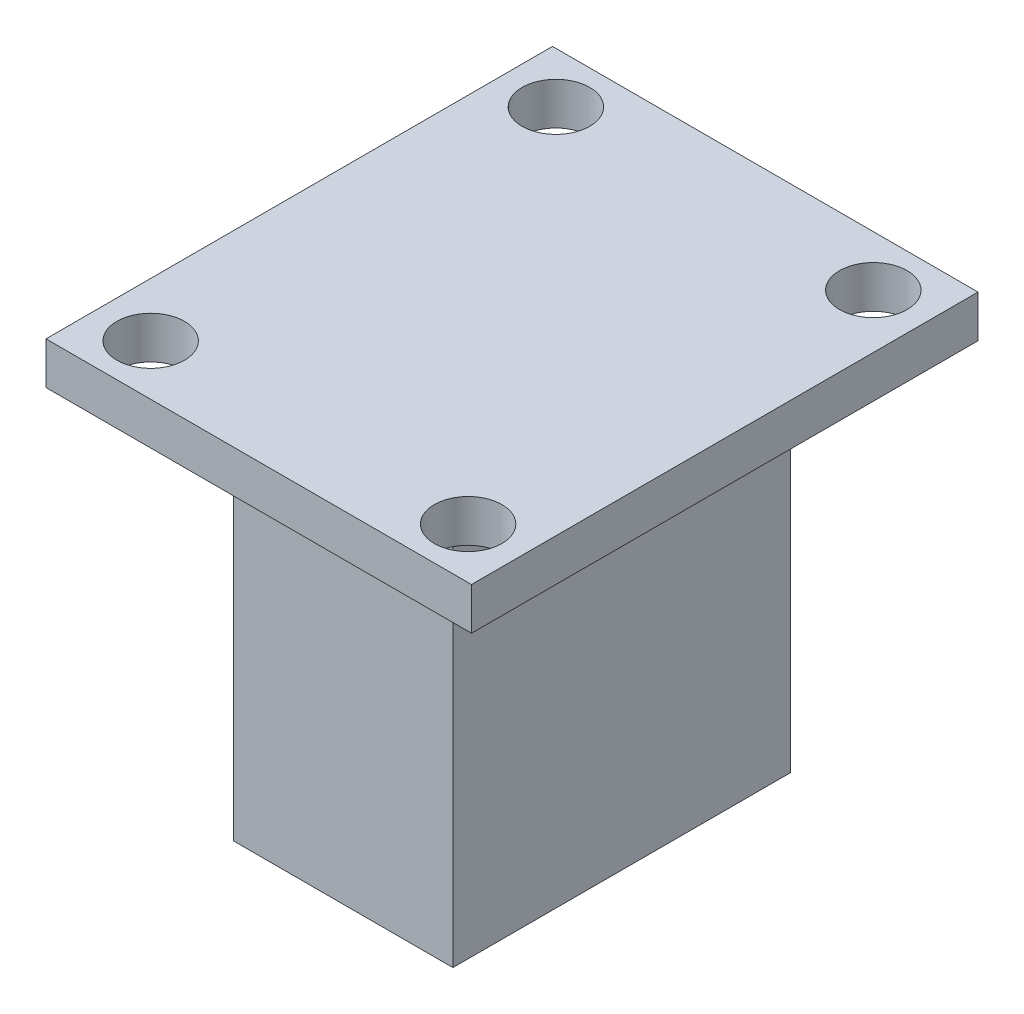
ISO-10303-21;
HEADER;
FILE_DESCRIPTION(('STEP AP214'),'2;1');
FILE_NAME('part.step','',(''),(''),'','','');
FILE_SCHEMA(('AUTOMOTIVE_DESIGN { 1 0 10303 214 1 1 1 1 }'));
ENDSEC;
DATA;
#1=APPLICATION_CONTEXT('core data for automotive mechanical design processes');
#2=APPLICATION_PROTOCOL_DEFINITION('international standard','automotive_design',2000,#1);
#3=PRODUCT_CONTEXT('',#1,'mechanical');
#4=PRODUCT('Part','Part','',(#3));
#5=PRODUCT_RELATED_PRODUCT_CATEGORY('part','',(#4));
#6=PRODUCT_DEFINITION_FORMATION('','',#4);
#7=PRODUCT_DEFINITION_CONTEXT('part definition',#1,'design');
#8=PRODUCT_DEFINITION('design','',#6,#7);
#9=PRODUCT_DEFINITION_SHAPE('','',#8);
#10=(LENGTH_UNIT() NAMED_UNIT(*) SI_UNIT(.MILLI.,.METRE.));
#11=(NAMED_UNIT(*) PLANE_ANGLE_UNIT() SI_UNIT($,.RADIAN.));
#12=(NAMED_UNIT(*) SI_UNIT($,.STERADIAN.) SOLID_ANGLE_UNIT());
#13=UNCERTAINTY_MEASURE_WITH_UNIT(LENGTH_MEASURE(1.E-05),#10,'distance_accuracy_value','');
#14=(GEOMETRIC_REPRESENTATION_CONTEXT(3) GLOBAL_UNCERTAINTY_ASSIGNED_CONTEXT((#13)) GLOBAL_UNIT_ASSIGNED_CONTEXT((#10,
#11,#12)) REPRESENTATION_CONTEXT('',''));
#15=CARTESIAN_POINT('',(0.,0.,0.));
#16=DIRECTION('',(0.,0.,1.));
#17=DIRECTION('',(1.,0.,0.));
#18=AXIS2_PLACEMENT_3D('',#15,#16,#17);
#19=CARTESIAN_POINT('',(-16.002,-3.175,19.05));
#20=DIRECTION('',(-1.,0.,0.));
#21=DIRECTION('',(0.,0.,1.));
#22=AXIS2_PLACEMENT_3D('',#19,#20,#21);
#23=PLANE('',#22);
#24=DIRECTION('',(0.,0.,1.));
#25=VECTOR('',#24,1.);
#26=CARTESIAN_POINT('',(-16.002,0.,19.05));
#27=LINE('',#26,#25);
#28=CARTESIAN_POINT('',(-16.002,0.,-19.05));
#29=VERTEX_POINT('',#28);
#30=CARTESIAN_POINT('',(-16.002,0.,19.05));
#31=VERTEX_POINT('',#30);
#32=EDGE_CURVE('E174',#29,#31,#27,.T.);
#33=ORIENTED_EDGE('',*,*,#32,.F.);
#34=DIRECTION('',(0.,1.,0.));
#35=VECTOR('',#34,1.);
#36=CARTESIAN_POINT('',(-16.002,-3.175,-19.05));
#37=LINE('',#36,#35);
#38=CARTESIAN_POINT('',(-16.002,-3.175,-19.05));
#39=VERTEX_POINT('',#38);
#40=EDGE_CURVE('E11',#39,#29,#37,.T.);
#41=ORIENTED_EDGE('',*,*,#40,.F.);
#42=DIRECTION('',(0.,0.,1.));
#43=VECTOR('',#42,1.);
#44=CARTESIAN_POINT('',(-16.002,-3.175,19.05));
#45=LINE('',#44,#43);
#46=CARTESIAN_POINT('',(-16.002,-3.175,19.05));
#47=VERTEX_POINT('',#46);
#48=EDGE_CURVE('E177',#39,#47,#45,.T.);
#49=ORIENTED_EDGE('',*,*,#48,.T.);
#50=DIRECTION('',(0.,1.,0.));
#51=VECTOR('',#50,1.);
#52=CARTESIAN_POINT('',(-16.002,-3.175,19.05));
#53=LINE('',#52,#51);
#54=EDGE_CURVE('E43',#47,#31,#53,.T.);
#55=ORIENTED_EDGE('',*,*,#54,.T.);
#56=EDGE_LOOP('',(#33,#41,#49,#55));
#57=FACE_BOUND('',#56,.T.);
#58=ADVANCED_FACE('F40',(#57),#23,.T.);
#59=CARTESIAN_POINT('',(16.002,-3.175,-19.05));
#60=DIRECTION('',(0.,0.,-1.));
#61=DIRECTION('',(-1.,0.,0.));
#62=AXIS2_PLACEMENT_3D('',#59,#60,#61);
#63=PLANE('',#62);
#64=DIRECTION('',(-1.,0.,0.));
#65=VECTOR('',#64,1.);
#66=CARTESIAN_POINT('',(16.002,0.,-19.05));
#67=LINE('',#66,#65);
#68=CARTESIAN_POINT('',(16.002,0.,-19.05));
#69=VERTEX_POINT('',#68);
#70=EDGE_CURVE('E180',#69,#29,#67,.T.);
#71=ORIENTED_EDGE('',*,*,#70,.F.);
#72=DIRECTION('',(0.,1.,0.));
#73=VECTOR('',#72,1.);
#74=CARTESIAN_POINT('',(16.002,-3.175,-19.05));
#75=LINE('',#74,#73);
#76=CARTESIAN_POINT('',(16.002,-3.175,-19.05));
#77=VERTEX_POINT('',#76);
#78=EDGE_CURVE('E48',#77,#69,#75,.T.);
#79=ORIENTED_EDGE('',*,*,#78,.F.);
#80=DIRECTION('',(-1.,0.,0.));
#81=VECTOR('',#80,1.);
#82=CARTESIAN_POINT('',(16.002,-3.175,-19.05));
#83=LINE('',#82,#81);
#84=EDGE_CURVE('E185',#77,#39,#83,.T.);
#85=ORIENTED_EDGE('',*,*,#84,.T.);
#86=ORIENTED_EDGE('',*,*,#40,.T.);
#87=EDGE_LOOP('',(#71,#79,#85,#86));
#88=FACE_BOUND('',#87,.T.);
#89=ADVANCED_FACE('F202',(#88),#63,.T.);
#90=CARTESIAN_POINT('',(16.002,-3.175,19.05));
#91=DIRECTION('',(1.,0.,0.));
#92=DIRECTION('',(0.,0.,-1.));
#93=AXIS2_PLACEMENT_3D('',#90,#91,#92);
#94=PLANE('',#93);
#95=DIRECTION('',(0.,0.,-1.));
#96=VECTOR('',#95,1.);
#97=CARTESIAN_POINT('',(16.002,0.,19.05));
#98=LINE('',#97,#96);
#99=CARTESIAN_POINT('',(16.002,0.,19.05));
#100=VERTEX_POINT('',#99);
#101=EDGE_CURVE('E192',#100,#69,#98,.T.);
#102=ORIENTED_EDGE('',*,*,#101,.F.);
#103=DIRECTION('',(0.,1.,0.));
#104=VECTOR('',#103,1.);
#105=CARTESIAN_POINT('',(16.002,-3.175,19.05));
#106=LINE('',#105,#104);
#107=CARTESIAN_POINT('',(16.002,-3.175,19.05));
#108=VERTEX_POINT('',#107);
#109=EDGE_CURVE('E197',#108,#100,#106,.T.);
#110=ORIENTED_EDGE('',*,*,#109,.F.);
#111=DIRECTION('',(0.,0.,-1.));
#112=VECTOR('',#111,1.);
#113=CARTESIAN_POINT('',(16.002,-3.175,19.05));
#114=LINE('',#113,#112);
#115=EDGE_CURVE('E182',#108,#77,#114,.T.);
#116=ORIENTED_EDGE('',*,*,#115,.T.);
#117=ORIENTED_EDGE('',*,*,#78,.T.);
#118=EDGE_LOOP('',(#102,#110,#116,#117));
#119=FACE_BOUND('',#118,.T.);
#120=ADVANCED_FACE('F206',(#119),#94,.T.);
#121=CARTESIAN_POINT('',(16.002,-3.175,19.05));
#122=DIRECTION('',(0.,0.,1.));
#123=DIRECTION('',(1.,0.,0.));
#124=AXIS2_PLACEMENT_3D('',#121,#122,#123);
#125=PLANE('',#124);
#126=DIRECTION('',(1.,0.,0.));
#127=VECTOR('',#126,1.);
#128=CARTESIAN_POINT('',(16.002,0.,19.05));
#129=LINE('',#128,#127);
#130=EDGE_CURVE('E189',#31,#100,#129,.T.);
#131=ORIENTED_EDGE('',*,*,#130,.F.);
#132=ORIENTED_EDGE('',*,*,#54,.F.);
#133=DIRECTION('',(1.,0.,0.));
#134=VECTOR('',#133,1.);
#135=CARTESIAN_POINT('',(16.002,-3.175,19.05));
#136=LINE('',#135,#134);
#137=EDGE_CURVE('E179',#47,#108,#136,.T.);
#138=ORIENTED_EDGE('',*,*,#137,.T.);
#139=ORIENTED_EDGE('',*,*,#109,.T.);
#140=EDGE_LOOP('',(#131,#132,#138,#139));
#141=FACE_BOUND('',#140,.T.);
#142=ADVANCED_FACE('F199',(#141),#125,.T.);
#143=CARTESIAN_POINT('',(0.,-3.175,0.));
#144=DIRECTION('',(0.,1.,0.));
#145=DIRECTION('',(0.,0.,1.));
#146=AXIS2_PLACEMENT_3D('',#143,#144,#145);
#147=PLANE('',#146);
#148=DIRECTION('',(-1.,0.,0.));
#149=VECTOR('',#148,1.);
#150=CARTESIAN_POINT('',(0.,-3.175,-12.7));
#151=LINE('',#150,#149);
#152=CARTESIAN_POINT('',(8.255,-3.175,-12.7));
#153=VERTEX_POINT('',#152);
#154=CARTESIAN_POINT('',(-8.255,-3.175,-12.7));
#155=VERTEX_POINT('',#154);
#156=EDGE_CURVE('E147',#153,#155,#151,.T.);
#157=ORIENTED_EDGE('',*,*,#156,.T.);
#158=DIRECTION('',(0.,0.,1.));
#159=VECTOR('',#158,1.);
#160=CARTESIAN_POINT('',(-8.255,-3.175,0.));
#161=LINE('',#160,#159);
#162=CARTESIAN_POINT('',(-8.255,-3.175,12.7));
#163=VERTEX_POINT('',#162);
#164=EDGE_CURVE('E150',#155,#163,#161,.T.);
#165=ORIENTED_EDGE('',*,*,#164,.T.);
#166=DIRECTION('',(1.,0.,0.));
#167=VECTOR('',#166,1.);
#168=CARTESIAN_POINT('',(0.,-3.175,12.7));
#169=LINE('',#168,#167);
#170=CARTESIAN_POINT('',(8.255,-3.175,12.7));
#171=VERTEX_POINT('',#170);
#172=EDGE_CURVE('E115',#163,#171,#169,.T.);
#173=ORIENTED_EDGE('',*,*,#172,.T.);
#174=DIRECTION('',(0.,0.,-1.));
#175=VECTOR('',#174,1.);
#176=CARTESIAN_POINT('',(8.255,-3.175,0.));
#177=LINE('',#176,#175);
#178=EDGE_CURVE('E144',#171,#153,#177,.T.);
#179=ORIENTED_EDGE('',*,*,#178,.T.);
#180=EDGE_LOOP('',(#157,#165,#173,#179));
#181=FACE_BOUND('',#180,.T.);
#182=CARTESIAN_POINT('',(11.938,-3.175,15.24));
#183=DIRECTION('',(0.,1.,0.));
#184=DIRECTION('',(0.,0.,1.));
#185=AXIS2_PLACEMENT_3D('',#182,#183,#184);
#186=CIRCLE('',#185,2.54);
#187=CARTESIAN_POINT('',(11.938,-3.175,17.78));
#188=VERTEX_POINT('',#187);
#189=EDGE_CURVE('E166',#188,#188,#186,.T.);
#190=ORIENTED_EDGE('',*,*,#189,.T.);
#191=EDGE_LOOP('',(#190));
#192=FACE_BOUND('',#191,.T.);
#193=CARTESIAN_POINT('',(-11.938,-3.175,15.24));
#194=DIRECTION('',(0.,1.,0.));
#195=DIRECTION('',(0.,0.,1.));
#196=AXIS2_PLACEMENT_3D('',#193,#194,#195);
#197=CIRCLE('',#196,2.54);
#198=CARTESIAN_POINT('',(-11.938,-3.175,17.78));
#199=VERTEX_POINT('',#198);
#200=EDGE_CURVE('E160',#199,#199,#197,.T.);
#201=ORIENTED_EDGE('',*,*,#200,.T.);
#202=EDGE_LOOP('',(#201));
#203=FACE_BOUND('',#202,.T.);
#204=CARTESIAN_POINT('',(-11.938,-3.175,-15.24));
#205=DIRECTION('',(0.,1.,0.));
#206=DIRECTION('',(0.,0.,1.));
#207=AXIS2_PLACEMENT_3D('',#204,#205,#206);
#208=CIRCLE('',#207,2.54);
#209=CARTESIAN_POINT('',(-11.938,-3.175,-12.7));
#210=VERTEX_POINT('',#209);
#211=EDGE_CURVE('E153',#210,#210,#208,.T.);
#212=ORIENTED_EDGE('',*,*,#211,.T.);
#213=EDGE_LOOP('',(#212));
#214=FACE_BOUND('',#213,.T.);
#215=CARTESIAN_POINT('',(11.938,-3.175,-15.24));
#216=DIRECTION('',(0.,1.,0.));
#217=DIRECTION('',(0.,0.,1.));
#218=AXIS2_PLACEMENT_3D('',#215,#216,#217);
#219=CIRCLE('',#218,2.54);
#220=CARTESIAN_POINT('',(11.938,-3.175,-12.7));
#221=VERTEX_POINT('',#220);
#222=EDGE_CURVE('E171',#221,#221,#219,.T.);
#223=ORIENTED_EDGE('',*,*,#222,.T.);
#224=EDGE_LOOP('',(#223));
#225=FACE_BOUND('',#224,.T.);
#226=ORIENTED_EDGE('',*,*,#48,.F.);
#227=ORIENTED_EDGE('',*,*,#84,.F.);
#228=ORIENTED_EDGE('',*,*,#115,.F.);
#229=ORIENTED_EDGE('',*,*,#137,.F.);
#230=EDGE_LOOP('',(#226,#227,#228,#229));
#231=FACE_BOUND('',#230,.T.);
#232=ADVANCED_FACE('F208',(#181,#192,#203,#214,#225,#231),#147,.F.);
#233=CARTESIAN_POINT('',(0.,0.,0.));
#234=DIRECTION('',(0.,1.,0.));
#235=DIRECTION('',(0.,0.,1.));
#236=AXIS2_PLACEMENT_3D('',#233,#234,#235);
#237=PLANE('',#236);
#238=CARTESIAN_POINT('',(11.938,0.,15.24));
#239=DIRECTION('',(0.,1.,0.));
#240=DIRECTION('',(0.,0.,1.));
#241=AXIS2_PLACEMENT_3D('',#238,#239,#240);
#242=CIRCLE('',#241,2.54);
#243=CARTESIAN_POINT('',(11.938,0.,17.78));
#244=VERTEX_POINT('',#243);
#245=EDGE_CURVE('E152',#244,#244,#242,.T.);
#246=ORIENTED_EDGE('',*,*,#245,.F.);
#247=EDGE_LOOP('',(#246));
#248=FACE_BOUND('',#247,.T.);
#249=CARTESIAN_POINT('',(-11.938,0.,15.24));
#250=DIRECTION('',(0.,1.,0.));
#251=DIRECTION('',(0.,0.,1.));
#252=AXIS2_PLACEMENT_3D('',#249,#250,#251);
#253=CIRCLE('',#252,2.54);
#254=CARTESIAN_POINT('',(-11.938,0.,17.78));
#255=VERTEX_POINT('',#254);
#256=EDGE_CURVE('E163',#255,#255,#253,.T.);
#257=ORIENTED_EDGE('',*,*,#256,.F.);
#258=EDGE_LOOP('',(#257));
#259=FACE_BOUND('',#258,.T.);
#260=CARTESIAN_POINT('',(-11.938,0.,-15.24));
#261=DIRECTION('',(0.,1.,0.));
#262=DIRECTION('',(0.,0.,1.));
#263=AXIS2_PLACEMENT_3D('',#260,#261,#262);
#264=CIRCLE('',#263,2.54);
#265=CARTESIAN_POINT('',(-11.938,0.,-12.7));
#266=VERTEX_POINT('',#265);
#267=EDGE_CURVE('E157',#266,#266,#264,.T.);
#268=ORIENTED_EDGE('',*,*,#267,.F.);
#269=EDGE_LOOP('',(#268));
#270=FACE_BOUND('',#269,.T.);
#271=CARTESIAN_POINT('',(11.938,0.,-15.24));
#272=DIRECTION('',(0.,1.,0.));
#273=DIRECTION('',(0.,0.,1.));
#274=AXIS2_PLACEMENT_3D('',#271,#272,#273);
#275=CIRCLE('',#274,2.54);
#276=CARTESIAN_POINT('',(11.938,0.,-12.7));
#277=VERTEX_POINT('',#276);
#278=EDGE_CURVE('E156',#277,#277,#275,.T.);
#279=ORIENTED_EDGE('',*,*,#278,.F.);
#280=EDGE_LOOP('',(#279));
#281=FACE_BOUND('',#280,.T.);
#282=ORIENTED_EDGE('',*,*,#32,.T.);
#283=ORIENTED_EDGE('',*,*,#130,.T.);
#284=ORIENTED_EDGE('',*,*,#101,.T.);
#285=ORIENTED_EDGE('',*,*,#70,.T.);
#286=EDGE_LOOP('',(#282,#283,#284,#285));
#287=FACE_BOUND('',#286,.T.);
#288=ADVANCED_FACE('F201',(#248,#259,#270,#281,#287),#237,.T.);
#289=CARTESIAN_POINT('',(11.938,-3.175,-15.24));
#290=DIRECTION('',(0.,1.,0.));
#291=DIRECTION('',(0.,0.,1.));
#292=AXIS2_PLACEMENT_3D('',#289,#290,#291);
#293=CYLINDRICAL_SURFACE('',#292,2.54);
#294=ORIENTED_EDGE('',*,*,#222,.F.);
#295=EDGE_LOOP('',(#294));
#296=FACE_BOUND('',#295,.T.);
#297=ORIENTED_EDGE('',*,*,#278,.T.);
#298=EDGE_LOOP('',(#297));
#299=FACE_BOUND('',#298,.T.);
#300=ADVANCED_FACE('F216',(#296,#299),#293,.F.);
#301=CARTESIAN_POINT('',(-11.938,-3.175,-15.24));
#302=DIRECTION('',(0.,1.,0.));
#303=DIRECTION('',(0.,0.,1.));
#304=AXIS2_PLACEMENT_3D('',#301,#302,#303);
#305=CYLINDRICAL_SURFACE('',#304,2.54);
#306=ORIENTED_EDGE('',*,*,#211,.F.);
#307=EDGE_LOOP('',(#306));
#308=FACE_BOUND('',#307,.T.);
#309=ORIENTED_EDGE('',*,*,#267,.T.);
#310=EDGE_LOOP('',(#309));
#311=FACE_BOUND('',#310,.T.);
#312=ADVANCED_FACE('F246',(#308,#311),#305,.F.);
#313=CARTESIAN_POINT('',(-11.938,-3.175,15.24));
#314=DIRECTION('',(0.,1.,0.));
#315=DIRECTION('',(0.,0.,1.));
#316=AXIS2_PLACEMENT_3D('',#313,#314,#315);
#317=CYLINDRICAL_SURFACE('',#316,2.54);
#318=ORIENTED_EDGE('',*,*,#200,.F.);
#319=EDGE_LOOP('',(#318));
#320=FACE_BOUND('',#319,.T.);
#321=ORIENTED_EDGE('',*,*,#256,.T.);
#322=EDGE_LOOP('',(#321));
#323=FACE_BOUND('',#322,.T.);
#324=ADVANCED_FACE('F256',(#320,#323),#317,.F.);
#325=CARTESIAN_POINT('',(11.938,-3.175,15.24));
#326=DIRECTION('',(0.,1.,0.));
#327=DIRECTION('',(0.,0.,1.));
#328=AXIS2_PLACEMENT_3D('',#325,#326,#327);
#329=CYLINDRICAL_SURFACE('',#328,2.54);
#330=ORIENTED_EDGE('',*,*,#189,.F.);
#331=EDGE_LOOP('',(#330));
#332=FACE_BOUND('',#331,.T.);
#333=ORIENTED_EDGE('',*,*,#245,.T.);
#334=EDGE_LOOP('',(#333));
#335=FACE_BOUND('',#334,.T.);
#336=ADVANCED_FACE('F266',(#332,#335),#329,.F.);
#337=CARTESIAN_POINT('',(-8.255,-32.004,-12.7));
#338=DIRECTION('',(-1.,0.,0.));
#339=DIRECTION('',(0.,0.,1.));
#340=AXIS2_PLACEMENT_3D('',#337,#338,#339);
#341=PLANE('',#340);
#342=ORIENTED_EDGE('',*,*,#164,.F.);
#343=DIRECTION('',(0.,1.,0.));
#344=VECTOR('',#343,1.);
#345=CARTESIAN_POINT('',(-8.255,-32.004,-12.7));
#346=LINE('',#345,#344);
#347=CARTESIAN_POINT('',(-8.255,-32.004,-12.7));
#348=VERTEX_POINT('',#347);
#349=EDGE_CURVE('E133',#348,#155,#346,.T.);
#350=ORIENTED_EDGE('',*,*,#349,.F.);
#351=DIRECTION('',(0.,0.,1.));
#352=VECTOR('',#351,1.);
#353=CARTESIAN_POINT('',(-8.255,-32.004,-12.7));
#354=LINE('',#353,#352);
#355=CARTESIAN_POINT('',(-8.255,-32.004,12.7));
#356=VERTEX_POINT('',#355);
#357=EDGE_CURVE('E126',#348,#356,#354,.T.);
#358=ORIENTED_EDGE('',*,*,#357,.T.);
#359=DIRECTION('',(0.,1.,0.));
#360=VECTOR('',#359,1.);
#361=CARTESIAN_POINT('',(-8.255,-32.004,12.7));
#362=LINE('',#361,#360);
#363=EDGE_CURVE('E110',#356,#163,#362,.T.);
#364=ORIENTED_EDGE('',*,*,#363,.T.);
#365=EDGE_LOOP('',(#342,#350,#358,#364));
#366=FACE_BOUND('',#365,.T.);
#367=ADVANCED_FACE('F131',(#366),#341,.T.);
#368=CARTESIAN_POINT('',(8.255,-32.004,-12.7));
#369=DIRECTION('',(0.,0.,-1.));
#370=DIRECTION('',(-1.,0.,0.));
#371=AXIS2_PLACEMENT_3D('',#368,#369,#370);
#372=PLANE('',#371);
#373=ORIENTED_EDGE('',*,*,#156,.F.);
#374=DIRECTION('',(0.,1.,0.));
#375=VECTOR('',#374,1.);
#376=CARTESIAN_POINT('',(8.255,-32.004,-12.7));
#377=LINE('',#376,#375);
#378=CARTESIAN_POINT('',(8.255,-32.004,-12.7));
#379=VERTEX_POINT('',#378);
#380=EDGE_CURVE('E139',#379,#153,#377,.T.);
#381=ORIENTED_EDGE('',*,*,#380,.F.);
#382=DIRECTION('',(-1.,0.,0.));
#383=VECTOR('',#382,1.);
#384=CARTESIAN_POINT('',(8.255,-32.004,-12.7));
#385=LINE('',#384,#383);
#386=EDGE_CURVE('E119',#379,#348,#385,.T.);
#387=ORIENTED_EDGE('',*,*,#386,.T.);
#388=ORIENTED_EDGE('',*,*,#349,.T.);
#389=EDGE_LOOP('',(#373,#381,#387,#388));
#390=FACE_BOUND('',#389,.T.);
#391=ADVANCED_FACE('F293',(#390),#372,.T.);
#392=CARTESIAN_POINT('',(8.255,-32.004,-12.7));
#393=DIRECTION('',(1.,0.,0.));
#394=DIRECTION('',(0.,0.,-1.));
#395=AXIS2_PLACEMENT_3D('',#392,#393,#394);
#396=PLANE('',#395);
#397=ORIENTED_EDGE('',*,*,#178,.F.);
#398=DIRECTION('',(0.,1.,0.));
#399=VECTOR('',#398,1.);
#400=CARTESIAN_POINT('',(8.255,-32.004,12.7));
#401=LINE('',#400,#399);
#402=CARTESIAN_POINT('',(8.255,-32.004,12.7));
#403=VERTEX_POINT('',#402);
#404=EDGE_CURVE('E56',#403,#171,#401,.T.);
#405=ORIENTED_EDGE('',*,*,#404,.F.);
#406=DIRECTION('',(0.,0.,-1.));
#407=VECTOR('',#406,1.);
#408=CARTESIAN_POINT('',(8.255,-32.004,-12.7));
#409=LINE('',#408,#407);
#410=EDGE_CURVE('E129',#403,#379,#409,.T.);
#411=ORIENTED_EDGE('',*,*,#410,.T.);
#412=ORIENTED_EDGE('',*,*,#380,.T.);
#413=EDGE_LOOP('',(#397,#405,#411,#412));
#414=FACE_BOUND('',#413,.T.);
#415=ADVANCED_FACE('F302',(#414),#396,.T.);
#416=CARTESIAN_POINT('',(8.255,-32.004,12.7));
#417=DIRECTION('',(0.,0.,1.));
#418=DIRECTION('',(1.,0.,0.));
#419=AXIS2_PLACEMENT_3D('',#416,#417,#418);
#420=PLANE('',#419);
#421=ORIENTED_EDGE('',*,*,#172,.F.);
#422=ORIENTED_EDGE('',*,*,#363,.F.);
#423=DIRECTION('',(1.,0.,0.));
#424=VECTOR('',#423,1.);
#425=CARTESIAN_POINT('',(8.255,-32.004,12.7));
#426=LINE('',#425,#424);
#427=EDGE_CURVE('E113',#356,#403,#426,.T.);
#428=ORIENTED_EDGE('',*,*,#427,.T.);
#429=ORIENTED_EDGE('',*,*,#404,.T.);
#430=EDGE_LOOP('',(#421,#422,#428,#429));
#431=FACE_BOUND('',#430,.T.);
#432=ADVANCED_FACE('F112',(#431),#420,.T.);
#433=CARTESIAN_POINT('',(0.,-32.004,0.));
#434=DIRECTION('',(0.,-1.,0.));
#435=DIRECTION('',(0.,0.,-1.));
#436=AXIS2_PLACEMENT_3D('',#433,#434,#435);
#437=PLANE('',#436);
#438=ORIENTED_EDGE('',*,*,#357,.F.);
#439=ORIENTED_EDGE('',*,*,#386,.F.);
#440=ORIENTED_EDGE('',*,*,#410,.F.);
#441=ORIENTED_EDGE('',*,*,#427,.F.);
#442=EDGE_LOOP('',(#438,#439,#440,#441));
#443=FACE_BOUND('',#442,.T.);
#444=ADVANCED_FACE('F124',(#443),#437,.T.);
#445=CLOSED_SHELL('',(#58,#89,#120,#142,#232,#288,#300,#312,#324,#336,#367,#391,#415,#432,#444));
#446=MANIFOLD_SOLID_BREP('B2',#445);
#447=ADVANCED_BREP_SHAPE_REPRESENTATION('',(#18,#446),#14);
#448=SHAPE_DEFINITION_REPRESENTATION(#9,#447);
ENDSEC;
END-ISO-10303-21;
